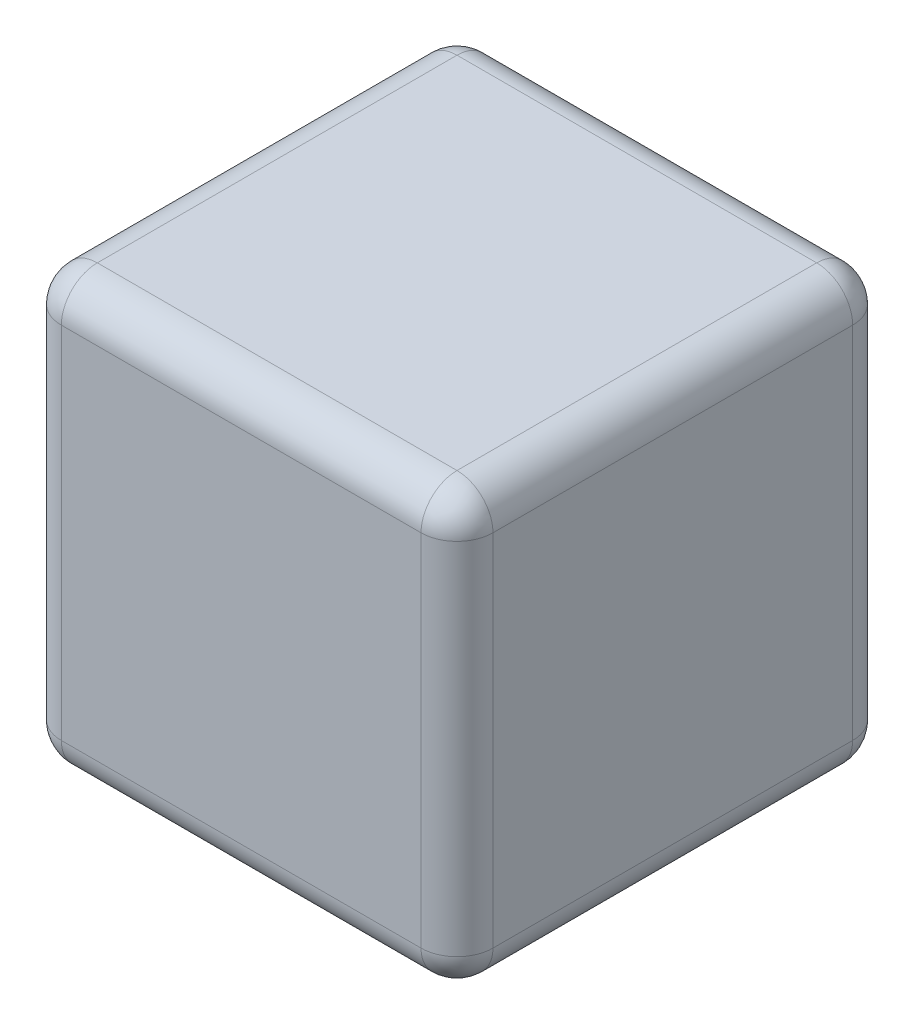
ISO-10303-21;
HEADER;
FILE_DESCRIPTION(('STEP AP214'),'2;1');
FILE_NAME('part.step','',(''),(''),'','','');
FILE_SCHEMA(('AUTOMOTIVE_DESIGN { 1 0 10303 214 1 1 1 1 }'));
ENDSEC;
DATA;
#1=APPLICATION_CONTEXT('core data for automotive mechanical design processes');
#2=APPLICATION_PROTOCOL_DEFINITION('international standard','automotive_design',2000,#1);
#3=PRODUCT_CONTEXT('',#1,'mechanical');
#4=PRODUCT('Part','Part','',(#3));
#5=PRODUCT_RELATED_PRODUCT_CATEGORY('part','',(#4));
#6=PRODUCT_DEFINITION_FORMATION('','',#4);
#7=PRODUCT_DEFINITION_CONTEXT('part definition',#1,'design');
#8=PRODUCT_DEFINITION('design','',#6,#7);
#9=PRODUCT_DEFINITION_SHAPE('','',#8);
#10=(LENGTH_UNIT() NAMED_UNIT(*) SI_UNIT(.MILLI.,.METRE.));
#11=(NAMED_UNIT(*) PLANE_ANGLE_UNIT() SI_UNIT($,.RADIAN.));
#12=(NAMED_UNIT(*) SI_UNIT($,.STERADIAN.) SOLID_ANGLE_UNIT());
#13=UNCERTAINTY_MEASURE_WITH_UNIT(LENGTH_MEASURE(1.E-05),#10,'distance_accuracy_value','');
#14=(GEOMETRIC_REPRESENTATION_CONTEXT(3) GLOBAL_UNCERTAINTY_ASSIGNED_CONTEXT((#13)) GLOBAL_UNIT_ASSIGNED_CONTEXT((#10,
#11,#12)) REPRESENTATION_CONTEXT('',''));
#15=CARTESIAN_POINT('',(0.,0.,0.));
#16=DIRECTION('',(0.,0.,1.));
#17=DIRECTION('',(1.,0.,0.));
#18=AXIS2_PLACEMENT_3D('',#15,#16,#17);
#19=CARTESIAN_POINT('',(1.5,1.5,3.));
#20=DIRECTION('',(-1.,0.,0.));
#21=DIRECTION('',(0.,-1.,0.));
#22=AXIS2_PLACEMENT_3D('',#19,#20,#21);
#23=PLANE('',#22);
#24=DIRECTION('',(0.,1.,0.));
#25=VECTOR('',#24,1.);
#26=CARTESIAN_POINT('',(1.5,-1.5,2.75));
#27=LINE('',#26,#25);
#28=CARTESIAN_POINT('',(1.5,1.25,2.75));
#29=VERTEX_POINT('',#28);
#30=CARTESIAN_POINT('',(1.5,-1.25,2.75));
#31=VERTEX_POINT('',#30);
#32=EDGE_CURVE('E142',#29,#31,#27,.F.);
#33=ORIENTED_EDGE('',*,*,#32,.T.);
#34=DIRECTION('',(0.,0.,-1.));
#35=VECTOR('',#34,1.);
#36=CARTESIAN_POINT('',(1.5,-1.25,3.));
#37=LINE('',#36,#35);
#38=CARTESIAN_POINT('',(1.5,-1.25,0.25));
#39=VERTEX_POINT('',#38);
#40=EDGE_CURVE('E137',#31,#39,#37,.T.);
#41=ORIENTED_EDGE('',*,*,#40,.T.);
#42=DIRECTION('',(0.,1.,0.));
#43=VECTOR('',#42,1.);
#44=CARTESIAN_POINT('',(1.5,1.5,0.25));
#45=LINE('',#44,#43);
#46=CARTESIAN_POINT('',(1.5,1.25,0.25));
#47=VERTEX_POINT('',#46);
#48=EDGE_CURVE('E132',#39,#47,#45,.T.);
#49=ORIENTED_EDGE('',*,*,#48,.T.);
#50=DIRECTION('',(0.,0.,-1.));
#51=VECTOR('',#50,1.);
#52=CARTESIAN_POINT('',(1.5,1.25,3.));
#53=LINE('',#52,#51);
#54=EDGE_CURVE('E134',#47,#29,#53,.F.);
#55=ORIENTED_EDGE('',*,*,#54,.T.);
#56=EDGE_LOOP('',(#33,#41,#49,#55));
#57=FACE_BOUND('',#56,.T.);
#58=ADVANCED_FACE('F39',(#57),#23,.F.);
#59=CARTESIAN_POINT('',(-1.5,1.5,3.));
#60=DIRECTION('',(0.,-1.,0.));
#61=DIRECTION('',(0.,0.,-1.));
#62=AXIS2_PLACEMENT_3D('',#59,#60,#61);
#63=PLANE('',#62);
#64=DIRECTION('',(-1.,0.,0.));
#65=VECTOR('',#64,1.);
#66=CARTESIAN_POINT('',(1.5,1.5,2.75));
#67=LINE('',#66,#65);
#68=CARTESIAN_POINT('',(-1.25,1.5,2.75));
#69=VERTEX_POINT('',#68);
#70=CARTESIAN_POINT('',(1.25,1.5,2.75));
#71=VERTEX_POINT('',#70);
#72=EDGE_CURVE('E256',#69,#71,#67,.F.);
#73=ORIENTED_EDGE('',*,*,#72,.T.);
#74=DIRECTION('',(0.,0.,-1.));
#75=VECTOR('',#74,1.);
#76=CARTESIAN_POINT('',(1.25,1.5,3.));
#77=LINE('',#76,#75);
#78=CARTESIAN_POINT('',(1.25,1.5,0.25));
#79=VERTEX_POINT('',#78);
#80=EDGE_CURVE('E11',#71,#79,#77,.T.);
#81=ORIENTED_EDGE('',*,*,#80,.T.);
#82=DIRECTION('',(-1.,0.,0.));
#83=VECTOR('',#82,1.);
#84=CARTESIAN_POINT('',(-1.5,1.5,0.25));
#85=LINE('',#84,#83);
#86=CARTESIAN_POINT('',(-1.25,1.5,0.25));
#87=VERTEX_POINT('',#86);
#88=EDGE_CURVE('E49',#79,#87,#85,.T.);
#89=ORIENTED_EDGE('',*,*,#88,.T.);
#90=DIRECTION('',(0.,0.,-1.));
#91=VECTOR('',#90,1.);
#92=CARTESIAN_POINT('',(-1.25,1.5,3.));
#93=LINE('',#92,#91);
#94=EDGE_CURVE('E259',#87,#69,#93,.F.);
#95=ORIENTED_EDGE('',*,*,#94,.T.);
#96=EDGE_LOOP('',(#73,#81,#89,#95));
#97=FACE_BOUND('',#96,.T.);
#98=ADVANCED_FACE('F375',(#97),#63,.F.);
#99=CARTESIAN_POINT('',(-1.5,1.5,3.));
#100=DIRECTION('',(1.,0.,0.));
#101=DIRECTION('',(0.,1.,0.));
#102=AXIS2_PLACEMENT_3D('',#99,#100,#101);
#103=PLANE('',#102);
#104=DIRECTION('',(0.,0.,-1.));
#105=VECTOR('',#104,1.);
#106=CARTESIAN_POINT('',(-1.5,1.25,3.));
#107=LINE('',#106,#105);
#108=CARTESIAN_POINT('',(-1.5,1.25,2.75));
#109=VERTEX_POINT('',#108);
#110=CARTESIAN_POINT('',(-1.5,1.25,0.25));
#111=VERTEX_POINT('',#110);
#112=EDGE_CURVE('E327',#109,#111,#107,.T.);
#113=ORIENTED_EDGE('',*,*,#112,.T.);
#114=DIRECTION('',(0.,-1.,0.));
#115=VECTOR('',#114,1.);
#116=CARTESIAN_POINT('',(-1.5,1.5,0.25));
#117=LINE('',#116,#115);
#118=CARTESIAN_POINT('',(-1.5,-1.25,0.25));
#119=VERTEX_POINT('',#118);
#120=EDGE_CURVE('E250',#111,#119,#117,.T.);
#121=ORIENTED_EDGE('',*,*,#120,.T.);
#122=DIRECTION('',(0.,0.,-1.));
#123=VECTOR('',#122,1.);
#124=CARTESIAN_POINT('',(-1.5,-1.25,3.));
#125=LINE('',#124,#123);
#126=CARTESIAN_POINT('',(-1.5,-1.25,2.75));
#127=VERTEX_POINT('',#126);
#128=EDGE_CURVE('E330',#119,#127,#125,.F.);
#129=ORIENTED_EDGE('',*,*,#128,.T.);
#130=DIRECTION('',(0.,-1.,0.));
#131=VECTOR('',#130,1.);
#132=CARTESIAN_POINT('',(-1.5,1.5,2.75));
#133=LINE('',#132,#131);
#134=EDGE_CURVE('E236',#127,#109,#133,.F.);
#135=ORIENTED_EDGE('',*,*,#134,.T.);
#136=EDGE_LOOP('',(#113,#121,#129,#135));
#137=FACE_BOUND('',#136,.T.);
#138=ADVANCED_FACE('F336',(#137),#103,.F.);
#139=CARTESIAN_POINT('',(-1.5,-1.5,3.));
#140=DIRECTION('',(0.,1.,0.));
#141=DIRECTION('',(0.,0.,1.));
#142=AXIS2_PLACEMENT_3D('',#139,#140,#141);
#143=PLANE('',#142);
#144=DIRECTION('',(1.,0.,0.));
#145=VECTOR('',#144,1.);
#146=CARTESIAN_POINT('',(-1.5,-1.5,0.25));
#147=LINE('',#146,#145);
#148=CARTESIAN_POINT('',(-1.25,-1.5,0.25));
#149=VERTEX_POINT('',#148);
#150=CARTESIAN_POINT('',(1.25,-1.5,0.25));
#151=VERTEX_POINT('',#150);
#152=EDGE_CURVE('E303',#149,#151,#147,.T.);
#153=ORIENTED_EDGE('',*,*,#152,.T.);
#154=DIRECTION('',(0.,0.,-1.));
#155=VECTOR('',#154,1.);
#156=CARTESIAN_POINT('',(1.25,-1.5,3.));
#157=LINE('',#156,#155);
#158=CARTESIAN_POINT('',(1.25,-1.5,2.75));
#159=VERTEX_POINT('',#158);
#160=EDGE_CURVE('E300',#151,#159,#157,.F.);
#161=ORIENTED_EDGE('',*,*,#160,.T.);
#162=DIRECTION('',(1.,0.,0.));
#163=VECTOR('',#162,1.);
#164=CARTESIAN_POINT('',(-1.5,-1.5,2.75));
#165=LINE('',#164,#163);
#166=CARTESIAN_POINT('',(-1.25,-1.5,2.75));
#167=VERTEX_POINT('',#166);
#168=EDGE_CURVE('E291',#159,#167,#165,.F.);
#169=ORIENTED_EDGE('',*,*,#168,.T.);
#170=DIRECTION('',(0.,0.,-1.));
#171=VECTOR('',#170,1.);
#172=CARTESIAN_POINT('',(-1.25,-1.5,3.));
#173=LINE('',#172,#171);
#174=EDGE_CURVE('E297',#167,#149,#173,.T.);
#175=ORIENTED_EDGE('',*,*,#174,.T.);
#176=EDGE_LOOP('',(#153,#161,#169,#175));
#177=FACE_BOUND('',#176,.T.);
#178=ADVANCED_FACE('F301',(#177),#143,.F.);
#179=CARTESIAN_POINT('',(0.,0.,3.));
#180=DIRECTION('',(0.,0.,1.));
#181=DIRECTION('',(1.,0.,0.));
#182=AXIS2_PLACEMENT_3D('',#179,#180,#181);
#183=PLANE('',#182);
#184=DIRECTION('',(0.,-1.,0.));
#185=VECTOR('',#184,1.);
#186=CARTESIAN_POINT('',(-1.25,-1.5,3.));
#187=LINE('',#186,#185);
#188=CARTESIAN_POINT('',(-1.25,1.25,3.));
#189=VERTEX_POINT('',#188);
#190=CARTESIAN_POINT('',(-1.25,-1.25,3.));
#191=VERTEX_POINT('',#190);
#192=EDGE_CURVE('E238',#189,#191,#187,.T.);
#193=ORIENTED_EDGE('',*,*,#192,.T.);
#194=DIRECTION('',(1.,0.,0.));
#195=VECTOR('',#194,1.);
#196=CARTESIAN_POINT('',(1.5,-1.25,3.));
#197=LINE('',#196,#195);
#198=CARTESIAN_POINT('',(1.25,-1.25,3.));
#199=VERTEX_POINT('',#198);
#200=EDGE_CURVE('E248',#191,#199,#197,.T.);
#201=ORIENTED_EDGE('',*,*,#200,.T.);
#202=DIRECTION('',(0.,1.,0.));
#203=VECTOR('',#202,1.);
#204=CARTESIAN_POINT('',(1.25,1.5,3.));
#205=LINE('',#204,#203);
#206=CARTESIAN_POINT('',(1.25,1.25,3.));
#207=VERTEX_POINT('',#206);
#208=EDGE_CURVE('E243',#199,#207,#205,.T.);
#209=ORIENTED_EDGE('',*,*,#208,.T.);
#210=DIRECTION('',(-1.,0.,0.));
#211=VECTOR('',#210,1.);
#212=CARTESIAN_POINT('',(-1.5,1.25,3.));
#213=LINE('',#212,#211);
#214=EDGE_CURVE('E244',#207,#189,#213,.T.);
#215=ORIENTED_EDGE('',*,*,#214,.T.);
#216=EDGE_LOOP('',(#193,#201,#209,#215));
#217=FACE_BOUND('',#216,.T.);
#218=ADVANCED_FACE('F349',(#217),#183,.T.);
#219=CARTESIAN_POINT('',(0.,0.,0.));
#220=DIRECTION('',(0.,0.,1.));
#221=DIRECTION('',(1.,0.,0.));
#222=AXIS2_PLACEMENT_3D('',#219,#220,#221);
#223=PLANE('',#222);
#224=DIRECTION('',(0.,1.,0.));
#225=VECTOR('',#224,1.);
#226=CARTESIAN_POINT('',(1.25,0.,0.));
#227=LINE('',#226,#225);
#228=CARTESIAN_POINT('',(1.25,1.25,0.));
#229=VERTEX_POINT('',#228);
#230=CARTESIAN_POINT('',(1.25,-1.25,0.));
#231=VERTEX_POINT('',#230);
#232=EDGE_CURVE('E159',#229,#231,#227,.F.);
#233=ORIENTED_EDGE('',*,*,#232,.T.);
#234=DIRECTION('',(1.,0.,0.));
#235=VECTOR('',#234,1.);
#236=CARTESIAN_POINT('',(0.,-1.25,0.));
#237=LINE('',#236,#235);
#238=CARTESIAN_POINT('',(-1.25,-1.25,0.));
#239=VERTEX_POINT('',#238);
#240=EDGE_CURVE('E321',#231,#239,#237,.F.);
#241=ORIENTED_EDGE('',*,*,#240,.T.);
#242=DIRECTION('',(0.,-1.,0.));
#243=VECTOR('',#242,1.);
#244=CARTESIAN_POINT('',(-1.25,0.,0.));
#245=LINE('',#244,#243);
#246=CARTESIAN_POINT('',(-1.25,1.25,0.));
#247=VERTEX_POINT('',#246);
#248=EDGE_CURVE('E312',#239,#247,#245,.F.);
#249=ORIENTED_EDGE('',*,*,#248,.T.);
#250=DIRECTION('',(-1.,0.,0.));
#251=VECTOR('',#250,1.);
#252=CARTESIAN_POINT('',(0.,1.25,0.));
#253=LINE('',#252,#251);
#254=EDGE_CURVE('E308',#247,#229,#253,.F.);
#255=ORIENTED_EDGE('',*,*,#254,.T.);
#256=EDGE_LOOP('',(#233,#241,#249,#255));
#257=FACE_BOUND('',#256,.T.);
#258=ADVANCED_FACE('F428',(#257),#223,.F.);
#259=CARTESIAN_POINT('',(-1.25,1.25,3.));
#260=DIRECTION('',(0.,0.,-1.));
#261=DIRECTION('',(-1.,0.,0.));
#262=AXIS2_PLACEMENT_3D('',#259,#260,#261);
#263=CYLINDRICAL_SURFACE('',#262,0.25);
#264=CARTESIAN_POINT('',(-1.25,1.25,2.75));
#265=DIRECTION('',(0.,0.,1.));
#266=DIRECTION('',(1.,0.,0.));
#267=AXIS2_PLACEMENT_3D('',#264,#265,#266);
#268=CIRCLE('',#267,0.25);
#269=EDGE_CURVE('E43',#69,#109,#268,.T.);
#270=ORIENTED_EDGE('',*,*,#269,.F.);
#271=ORIENTED_EDGE('',*,*,#94,.F.);
#272=CARTESIAN_POINT('',(-1.25,1.25,0.25));
#273=DIRECTION('',(0.,0.,-1.));
#274=DIRECTION('',(-1.,0.,0.));
#275=AXIS2_PLACEMENT_3D('',#272,#273,#274);
#276=CIRCLE('',#275,0.25);
#277=EDGE_CURVE('E214',#111,#87,#276,.T.);
#278=ORIENTED_EDGE('',*,*,#277,.F.);
#279=ORIENTED_EDGE('',*,*,#112,.F.);
#280=EDGE_LOOP('',(#270,#271,#278,#279));
#281=FACE_BOUND('',#280,.T.);
#282=ADVANCED_FACE('F41',(#281),#263,.T.);
#283=CARTESIAN_POINT('',(-1.25,1.25,2.75));
#284=DIRECTION('',(0.,0.,1.));
#285=DIRECTION('',(1.,0.,0.));
#286=AXIS2_PLACEMENT_3D('',#283,#284,#285);
#287=SPHERICAL_SURFACE('',#286,0.25);
#288=CARTESIAN_POINT('',(-1.25,1.25,2.75));
#289=DIRECTION('',(-1.,0.,0.));
#290=DIRECTION('',(0.,0.,1.));
#291=AXIS2_PLACEMENT_3D('',#288,#289,#290);
#292=CIRCLE('',#291,0.25);
#293=EDGE_CURVE('E207',#69,#189,#292,.F.);
#294=ORIENTED_EDGE('',*,*,#293,.F.);
#295=ORIENTED_EDGE('',*,*,#269,.T.);
#296=CARTESIAN_POINT('',(-1.25,1.25,2.75));
#297=DIRECTION('',(0.,1.,0.));
#298=DIRECTION('',(0.,0.,1.));
#299=AXIS2_PLACEMENT_3D('',#296,#297,#298);
#300=CIRCLE('',#299,0.25);
#301=EDGE_CURVE('E211',#189,#109,#300,.F.);
#302=ORIENTED_EDGE('',*,*,#301,.F.);
#303=EDGE_LOOP('',(#294,#295,#302));
#304=FACE_BOUND('',#303,.T.);
#305=ADVANCED_FACE('F227',(#304),#287,.T.);
#306=CARTESIAN_POINT('',(-1.25,1.25,0.25));
#307=DIRECTION('',(0.,0.,1.));
#308=DIRECTION('',(1.,0.,0.));
#309=AXIS2_PLACEMENT_3D('',#306,#307,#308);
#310=SPHERICAL_SURFACE('',#309,0.25);
#311=CARTESIAN_POINT('',(-1.25,1.25,0.25));
#312=DIRECTION('',(0.,1.,0.));
#313=DIRECTION('',(0.,0.,1.));
#314=AXIS2_PLACEMENT_3D('',#311,#312,#313);
#315=CIRCLE('',#314,0.25);
#316=EDGE_CURVE('E199',#111,#247,#315,.F.);
#317=ORIENTED_EDGE('',*,*,#316,.F.);
#318=ORIENTED_EDGE('',*,*,#277,.T.);
#319=CARTESIAN_POINT('',(-1.25,1.25,0.25));
#320=DIRECTION('',(-1.,0.,0.));
#321=DIRECTION('',(0.,0.,1.));
#322=AXIS2_PLACEMENT_3D('',#319,#320,#321);
#323=CIRCLE('',#322,0.25);
#324=EDGE_CURVE('E203',#247,#87,#323,.F.);
#325=ORIENTED_EDGE('',*,*,#324,.F.);
#326=EDGE_LOOP('',(#317,#318,#325));
#327=FACE_BOUND('',#326,.T.);
#328=ADVANCED_FACE('F422',(#327),#310,.T.);
#329=CARTESIAN_POINT('',(-1.25,0.,2.75));
#330=DIRECTION('',(0.,1.,0.));
#331=DIRECTION('',(-1.,0.,0.));
#332=AXIS2_PLACEMENT_3D('',#329,#330,#331);
#333=CYLINDRICAL_SURFACE('',#332,0.25);
#334=ORIENTED_EDGE('',*,*,#301,.T.);
#335=ORIENTED_EDGE('',*,*,#134,.F.);
#336=CARTESIAN_POINT('',(-1.25,-1.25,2.75));
#337=DIRECTION('',(0.,-1.,0.));
#338=DIRECTION('',(0.,0.,-1.));
#339=AXIS2_PLACEMENT_3D('',#336,#337,#338);
#340=CIRCLE('',#339,0.25);
#341=EDGE_CURVE('E191',#191,#127,#340,.T.);
#342=ORIENTED_EDGE('',*,*,#341,.F.);
#343=ORIENTED_EDGE('',*,*,#192,.F.);
#344=EDGE_LOOP('',(#334,#335,#342,#343));
#345=FACE_BOUND('',#344,.T.);
#346=ADVANCED_FACE('F234',(#345),#333,.T.);
#347=CARTESIAN_POINT('',(0.,1.25,2.75));
#348=DIRECTION('',(1.,0.,0.));
#349=DIRECTION('',(0.,0.,-1.));
#350=AXIS2_PLACEMENT_3D('',#347,#348,#349);
#351=CYLINDRICAL_SURFACE('',#350,0.25);
#352=ORIENTED_EDGE('',*,*,#293,.T.);
#353=ORIENTED_EDGE('',*,*,#214,.F.);
#354=CARTESIAN_POINT('',(1.25,1.25,2.75));
#355=DIRECTION('',(1.,0.,0.));
#356=DIRECTION('',(0.,0.,-1.));
#357=AXIS2_PLACEMENT_3D('',#354,#355,#356);
#358=CIRCLE('',#357,0.25);
#359=EDGE_CURVE('E187',#71,#207,#358,.T.);
#360=ORIENTED_EDGE('',*,*,#359,.F.);
#361=ORIENTED_EDGE('',*,*,#72,.F.);
#362=EDGE_LOOP('',(#352,#353,#360,#361));
#363=FACE_BOUND('',#362,.T.);
#364=ADVANCED_FACE('F354',(#363),#351,.T.);
#365=CARTESIAN_POINT('',(1.25,1.25,3.));
#366=DIRECTION('',(0.,0.,-1.));
#367=DIRECTION('',(-1.,0.,0.));
#368=AXIS2_PLACEMENT_3D('',#365,#366,#367);
#369=CYLINDRICAL_SURFACE('',#368,0.25);
#370=CARTESIAN_POINT('',(1.25,1.25,0.25));
#371=DIRECTION('',(0.,0.,-1.));
#372=DIRECTION('',(-1.,0.,0.));
#373=AXIS2_PLACEMENT_3D('',#370,#371,#372);
#374=CIRCLE('',#373,0.25);
#375=EDGE_CURVE('E147',#79,#47,#374,.T.);
#376=ORIENTED_EDGE('',*,*,#375,.F.);
#377=ORIENTED_EDGE('',*,*,#80,.F.);
#378=CARTESIAN_POINT('',(1.25,1.25,2.75));
#379=DIRECTION('',(0.,0.,1.));
#380=DIRECTION('',(1.,0.,0.));
#381=AXIS2_PLACEMENT_3D('',#378,#379,#380);
#382=CIRCLE('',#381,0.25);
#383=EDGE_CURVE('E149',#29,#71,#382,.T.);
#384=ORIENTED_EDGE('',*,*,#383,.F.);
#385=ORIENTED_EDGE('',*,*,#54,.F.);
#386=EDGE_LOOP('',(#376,#377,#384,#385));
#387=FACE_BOUND('',#386,.T.);
#388=ADVANCED_FACE('F145',(#387),#369,.T.);
#389=CARTESIAN_POINT('',(-1.5,1.25,0.25));
#390=DIRECTION('',(-1.,0.,0.));
#391=DIRECTION('',(0.,0.,1.));
#392=AXIS2_PLACEMENT_3D('',#389,#390,#391);
#393=CYLINDRICAL_SURFACE('',#392,0.25);
#394=ORIENTED_EDGE('',*,*,#324,.T.);
#395=ORIENTED_EDGE('',*,*,#88,.F.);
#396=CARTESIAN_POINT('',(1.25,1.25,0.25));
#397=DIRECTION('',(1.,0.,0.));
#398=DIRECTION('',(0.,1.,0.));
#399=AXIS2_PLACEMENT_3D('',#396,#397,#398);
#400=CIRCLE('',#399,0.25);
#401=EDGE_CURVE('E57',#229,#79,#400,.T.);
#402=ORIENTED_EDGE('',*,*,#401,.F.);
#403=ORIENTED_EDGE('',*,*,#254,.F.);
#404=EDGE_LOOP('',(#394,#395,#402,#403));
#405=FACE_BOUND('',#404,.T.);
#406=ADVANCED_FACE('F412',(#405),#393,.T.);
#407=CARTESIAN_POINT('',(-1.25,1.5,0.25));
#408=DIRECTION('',(0.,-1.,0.));
#409=DIRECTION('',(1.,0.,0.));
#410=AXIS2_PLACEMENT_3D('',#407,#408,#409);
#411=CYLINDRICAL_SURFACE('',#410,0.25);
#412=ORIENTED_EDGE('',*,*,#316,.T.);
#413=ORIENTED_EDGE('',*,*,#248,.F.);
#414=CARTESIAN_POINT('',(-1.25,-1.25,0.25));
#415=DIRECTION('',(0.,-1.,0.));
#416=DIRECTION('',(0.,0.,-1.));
#417=AXIS2_PLACEMENT_3D('',#414,#415,#416);
#418=CIRCLE('',#417,0.25);
#419=EDGE_CURVE('E179',#119,#239,#418,.T.);
#420=ORIENTED_EDGE('',*,*,#419,.F.);
#421=ORIENTED_EDGE('',*,*,#120,.F.);
#422=EDGE_LOOP('',(#412,#413,#420,#421));
#423=FACE_BOUND('',#422,.T.);
#424=ADVANCED_FACE('F340',(#423),#411,.T.);
#425=CARTESIAN_POINT('',(-1.25,-1.25,3.));
#426=DIRECTION('',(0.,0.,-1.));
#427=DIRECTION('',(-1.,0.,0.));
#428=AXIS2_PLACEMENT_3D('',#425,#426,#427);
#429=CYLINDRICAL_SURFACE('',#428,0.25);
#430=CARTESIAN_POINT('',(-1.25,-1.25,2.75));
#431=DIRECTION('',(0.,0.,1.));
#432=DIRECTION('',(1.,0.,0.));
#433=AXIS2_PLACEMENT_3D('',#430,#431,#432);
#434=CIRCLE('',#433,0.25);
#435=EDGE_CURVE('E195',#127,#167,#434,.T.);
#436=ORIENTED_EDGE('',*,*,#435,.F.);
#437=ORIENTED_EDGE('',*,*,#128,.F.);
#438=CARTESIAN_POINT('',(-1.25,-1.25,0.25));
#439=DIRECTION('',(0.,0.,-1.));
#440=DIRECTION('',(-1.,0.,0.));
#441=AXIS2_PLACEMENT_3D('',#438,#439,#440);
#442=CIRCLE('',#441,0.25);
#443=EDGE_CURVE('E176',#149,#119,#442,.T.);
#444=ORIENTED_EDGE('',*,*,#443,.F.);
#445=ORIENTED_EDGE('',*,*,#174,.F.);
#446=EDGE_LOOP('',(#436,#437,#444,#445));
#447=FACE_BOUND('',#446,.T.);
#448=ADVANCED_FACE('F346',(#447),#429,.T.);
#449=CARTESIAN_POINT('',(-1.25,-1.25,2.75));
#450=DIRECTION('',(0.,0.,1.));
#451=DIRECTION('',(1.,0.,0.));
#452=AXIS2_PLACEMENT_3D('',#449,#450,#451);
#453=SPHERICAL_SURFACE('',#452,0.25);
#454=ORIENTED_EDGE('',*,*,#341,.T.);
#455=ORIENTED_EDGE('',*,*,#435,.T.);
#456=CARTESIAN_POINT('',(-1.25,-1.25,2.75));
#457=DIRECTION('',(-1.,0.,0.));
#458=DIRECTION('',(0.,0.,1.));
#459=AXIS2_PLACEMENT_3D('',#456,#457,#458);
#460=CIRCLE('',#459,0.25);
#461=EDGE_CURVE('E167',#191,#167,#460,.F.);
#462=ORIENTED_EDGE('',*,*,#461,.F.);
#463=EDGE_LOOP('',(#454,#455,#462));
#464=FACE_BOUND('',#463,.T.);
#465=ADVANCED_FACE('F348',(#464),#453,.T.);
#466=CARTESIAN_POINT('',(1.25,1.25,2.75));
#467=DIRECTION('',(0.,0.,1.));
#468=DIRECTION('',(1.,0.,0.));
#469=AXIS2_PLACEMENT_3D('',#466,#467,#468);
#470=SPHERICAL_SURFACE('',#469,0.25);
#471=ORIENTED_EDGE('',*,*,#383,.T.);
#472=ORIENTED_EDGE('',*,*,#359,.T.);
#473=CARTESIAN_POINT('',(1.25,1.25,2.75));
#474=DIRECTION('',(0.,1.,0.));
#475=DIRECTION('',(0.,0.,1.));
#476=AXIS2_PLACEMENT_3D('',#473,#474,#475);
#477=CIRCLE('',#476,0.25);
#478=EDGE_CURVE('E161',#29,#207,#477,.F.);
#479=ORIENTED_EDGE('',*,*,#478,.F.);
#480=EDGE_LOOP('',(#471,#472,#479));
#481=FACE_BOUND('',#480,.T.);
#482=ADVANCED_FACE('F356',(#481),#470,.T.);
#483=CARTESIAN_POINT('',(1.25,1.25,0.25));
#484=DIRECTION('',(0.,0.,1.));
#485=DIRECTION('',(1.,0.,0.));
#486=AXIS2_PLACEMENT_3D('',#483,#484,#485);
#487=SPHERICAL_SURFACE('',#486,0.25);
#488=ORIENTED_EDGE('',*,*,#401,.T.);
#489=ORIENTED_EDGE('',*,*,#375,.T.);
#490=CARTESIAN_POINT('',(1.25,1.25,0.25));
#491=DIRECTION('',(0.,1.,0.));
#492=DIRECTION('',(0.,0.,1.));
#493=AXIS2_PLACEMENT_3D('',#490,#491,#492);
#494=CIRCLE('',#493,0.25);
#495=EDGE_CURVE('E154',#229,#47,#494,.F.);
#496=ORIENTED_EDGE('',*,*,#495,.F.);
#497=EDGE_LOOP('',(#488,#489,#496));
#498=FACE_BOUND('',#497,.T.);
#499=ADVANCED_FACE('F153',(#498),#487,.T.);
#500=CARTESIAN_POINT('',(-1.25,-1.25,0.25));
#501=DIRECTION('',(0.,0.,1.));
#502=DIRECTION('',(1.,0.,0.));
#503=AXIS2_PLACEMENT_3D('',#500,#501,#502);
#504=SPHERICAL_SURFACE('',#503,0.25);
#505=ORIENTED_EDGE('',*,*,#443,.T.);
#506=ORIENTED_EDGE('',*,*,#419,.T.);
#507=CARTESIAN_POINT('',(-1.25,-1.25,0.25));
#508=DIRECTION('',(-1.,0.,0.));
#509=DIRECTION('',(0.,0.,1.));
#510=AXIS2_PLACEMENT_3D('',#507,#508,#509);
#511=CIRCLE('',#510,0.25);
#512=EDGE_CURVE('E162',#149,#239,#511,.F.);
#513=ORIENTED_EDGE('',*,*,#512,.F.);
#514=EDGE_LOOP('',(#505,#506,#513));
#515=FACE_BOUND('',#514,.T.);
#516=ADVANCED_FACE('F372',(#515),#504,.T.);
#517=CARTESIAN_POINT('',(0.,-1.25,2.75));
#518=DIRECTION('',(-1.,0.,0.));
#519=DIRECTION('',(0.,0.,1.));
#520=AXIS2_PLACEMENT_3D('',#517,#518,#519);
#521=CYLINDRICAL_SURFACE('',#520,0.25);
#522=ORIENTED_EDGE('',*,*,#461,.T.);
#523=ORIENTED_EDGE('',*,*,#168,.F.);
#524=CARTESIAN_POINT('',(1.25,-1.25,2.75));
#525=DIRECTION('',(1.,0.,0.));
#526=DIRECTION('',(0.,0.,-1.));
#527=AXIS2_PLACEMENT_3D('',#524,#525,#526);
#528=CIRCLE('',#527,0.25);
#529=EDGE_CURVE('E169',#199,#159,#528,.T.);
#530=ORIENTED_EDGE('',*,*,#529,.F.);
#531=ORIENTED_EDGE('',*,*,#200,.F.);
#532=EDGE_LOOP('',(#522,#523,#530,#531));
#533=FACE_BOUND('',#532,.T.);
#534=ADVANCED_FACE('F293',(#533),#521,.T.);
#535=CARTESIAN_POINT('',(1.25,0.,2.75));
#536=DIRECTION('',(0.,-1.,0.));
#537=DIRECTION('',(1.,0.,0.));
#538=AXIS2_PLACEMENT_3D('',#535,#536,#537);
#539=CYLINDRICAL_SURFACE('',#538,0.25);
#540=ORIENTED_EDGE('',*,*,#478,.T.);
#541=ORIENTED_EDGE('',*,*,#208,.F.);
#542=CARTESIAN_POINT('',(1.25,-1.25,2.75));
#543=DIRECTION('',(0.,-1.,0.));
#544=DIRECTION('',(0.,0.,-1.));
#545=AXIS2_PLACEMENT_3D('',#542,#543,#544);
#546=CIRCLE('',#545,0.25);
#547=EDGE_CURVE('E278',#31,#199,#546,.T.);
#548=ORIENTED_EDGE('',*,*,#547,.F.);
#549=ORIENTED_EDGE('',*,*,#32,.F.);
#550=EDGE_LOOP('',(#540,#541,#548,#549));
#551=FACE_BOUND('',#550,.T.);
#552=ADVANCED_FACE('F358',(#551),#539,.T.);
#553=CARTESIAN_POINT('',(1.25,1.5,0.25));
#554=DIRECTION('',(0.,1.,0.));
#555=DIRECTION('',(-1.,0.,0.));
#556=AXIS2_PLACEMENT_3D('',#553,#554,#555);
#557=CYLINDRICAL_SURFACE('',#556,0.25);
#558=ORIENTED_EDGE('',*,*,#495,.T.);
#559=ORIENTED_EDGE('',*,*,#48,.F.);
#560=CARTESIAN_POINT('',(1.25,-1.25,0.25));
#561=DIRECTION('',(0.,-1.,0.));
#562=DIRECTION('',(1.,0.,0.));
#563=AXIS2_PLACEMENT_3D('',#560,#561,#562);
#564=CIRCLE('',#563,0.25);
#565=EDGE_CURVE('E274',#231,#39,#564,.T.);
#566=ORIENTED_EDGE('',*,*,#565,.F.);
#567=ORIENTED_EDGE('',*,*,#232,.F.);
#568=EDGE_LOOP('',(#558,#559,#566,#567));
#569=FACE_BOUND('',#568,.T.);
#570=ADVANCED_FACE('F158',(#569),#557,.T.);
#571=CARTESIAN_POINT('',(-1.5,-1.25,0.25));
#572=DIRECTION('',(1.,0.,0.));
#573=DIRECTION('',(0.,0.,-1.));
#574=AXIS2_PLACEMENT_3D('',#571,#572,#573);
#575=CYLINDRICAL_SURFACE('',#574,0.25);
#576=ORIENTED_EDGE('',*,*,#512,.T.);
#577=ORIENTED_EDGE('',*,*,#240,.F.);
#578=CARTESIAN_POINT('',(1.25,-1.25,0.25));
#579=DIRECTION('',(1.,0.,0.));
#580=DIRECTION('',(0.,0.,-1.));
#581=AXIS2_PLACEMENT_3D('',#578,#579,#580);
#582=CIRCLE('',#581,0.25);
#583=EDGE_CURVE('E270',#151,#231,#582,.T.);
#584=ORIENTED_EDGE('',*,*,#583,.F.);
#585=ORIENTED_EDGE('',*,*,#152,.F.);
#586=EDGE_LOOP('',(#576,#577,#584,#585));
#587=FACE_BOUND('',#586,.T.);
#588=ADVANCED_FACE('F370',(#587),#575,.T.);
#589=CARTESIAN_POINT('',(1.25,-1.25,2.75));
#590=DIRECTION('',(0.,0.,1.));
#591=DIRECTION('',(1.,0.,0.));
#592=AXIS2_PLACEMENT_3D('',#589,#590,#591);
#593=SPHERICAL_SURFACE('',#592,0.25);
#594=ORIENTED_EDGE('',*,*,#547,.T.);
#595=ORIENTED_EDGE('',*,*,#529,.T.);
#596=CARTESIAN_POINT('',(1.25,-1.25,2.75));
#597=DIRECTION('',(0.,0.,1.));
#598=DIRECTION('',(1.,0.,0.));
#599=AXIS2_PLACEMENT_3D('',#596,#597,#598);
#600=CIRCLE('',#599,0.25);
#601=EDGE_CURVE('E267',#31,#159,#600,.F.);
#602=ORIENTED_EDGE('',*,*,#601,.F.);
#603=EDGE_LOOP('',(#594,#595,#602));
#604=FACE_BOUND('',#603,.T.);
#605=ADVANCED_FACE('F286',(#604),#593,.T.);
#606=CARTESIAN_POINT('',(1.25,-1.25,0.25));
#607=DIRECTION('',(0.,0.,1.));
#608=DIRECTION('',(1.,0.,0.));
#609=AXIS2_PLACEMENT_3D('',#606,#607,#608);
#610=SPHERICAL_SURFACE('',#609,0.25);
#611=ORIENTED_EDGE('',*,*,#583,.T.);
#612=ORIENTED_EDGE('',*,*,#565,.T.);
#613=CARTESIAN_POINT('',(1.25,-1.25,0.25));
#614=DIRECTION('',(0.,0.,-1.));
#615=DIRECTION('',(-1.,0.,0.));
#616=AXIS2_PLACEMENT_3D('',#613,#614,#615);
#617=CIRCLE('',#616,0.25);
#618=EDGE_CURVE('E264',#151,#39,#617,.F.);
#619=ORIENTED_EDGE('',*,*,#618,.F.);
#620=EDGE_LOOP('',(#611,#612,#619));
#621=FACE_BOUND('',#620,.T.);
#622=ADVANCED_FACE('F386',(#621),#610,.T.);
#623=CARTESIAN_POINT('',(1.25,-1.25,3.));
#624=DIRECTION('',(0.,0.,-1.));
#625=DIRECTION('',(-1.,0.,0.));
#626=AXIS2_PLACEMENT_3D('',#623,#624,#625);
#627=CYLINDRICAL_SURFACE('',#626,0.25);
#628=ORIENTED_EDGE('',*,*,#601,.T.);
#629=ORIENTED_EDGE('',*,*,#160,.F.);
#630=ORIENTED_EDGE('',*,*,#618,.T.);
#631=ORIENTED_EDGE('',*,*,#40,.F.);
#632=EDGE_LOOP('',(#628,#629,#630,#631));
#633=FACE_BOUND('',#632,.T.);
#634=ADVANCED_FACE('F383',(#633),#627,.T.);
#635=CLOSED_SHELL('',(#58,#98,#138,#178,#218,#258,#282,#305,#328,#346,#364,#388,#406,#424,#448,
#465,#482,#499,#516,#534,#552,#570,#588,#605,#622,#634));
#636=MANIFOLD_SOLID_BREP('B2',#635);
#637=ADVANCED_BREP_SHAPE_REPRESENTATION('',(#18,#636),#14);
#638=SHAPE_DEFINITION_REPRESENTATION(#9,#637);
ENDSEC;
END-ISO-10303-21;
